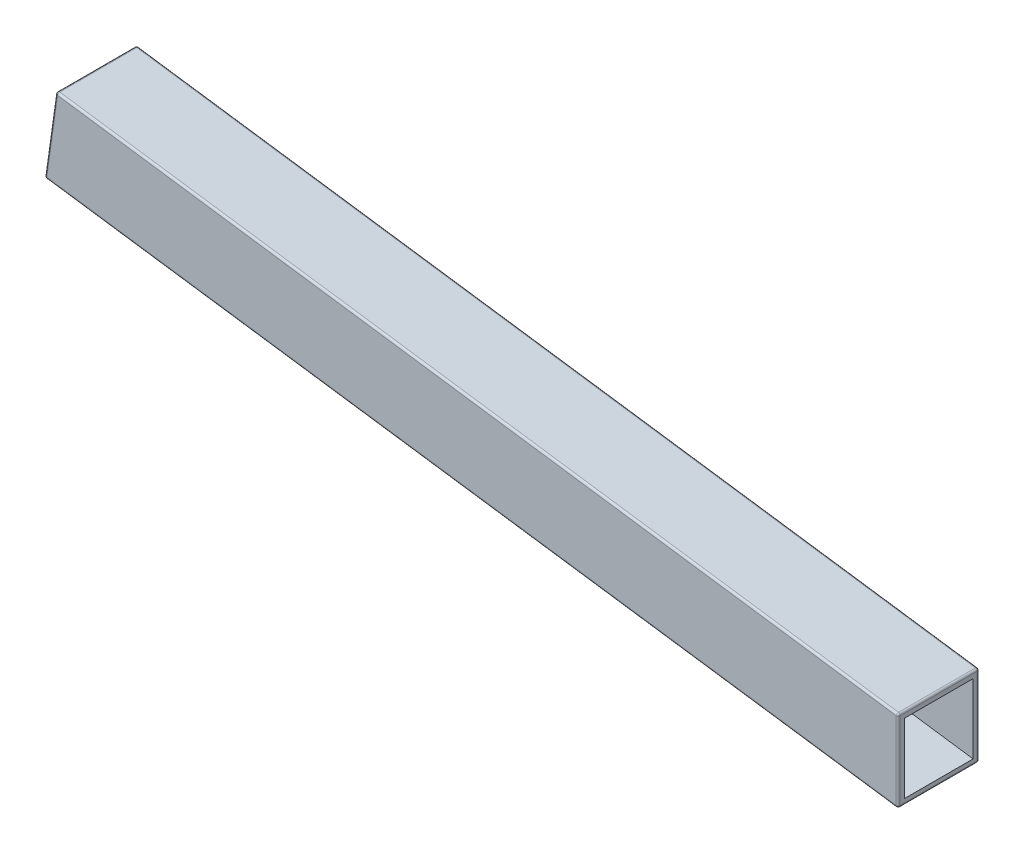
ISO-10303-21;
HEADER;
FILE_DESCRIPTION(('STEP AP214'),'2;1');
FILE_NAME('part.step','',(''),(''),'','','');
FILE_SCHEMA(('AUTOMOTIVE_DESIGN { 1 0 10303 214 1 1 1 1 }'));
ENDSEC;
DATA;
#1=APPLICATION_CONTEXT('core data for automotive mechanical design processes');
#2=APPLICATION_PROTOCOL_DEFINITION('international standard','automotive_design',2000,#1);
#3=PRODUCT_CONTEXT('',#1,'mechanical');
#4=PRODUCT('Part','Part','',(#3));
#5=PRODUCT_RELATED_PRODUCT_CATEGORY('part','',(#4));
#6=PRODUCT_DEFINITION_FORMATION('','',#4);
#7=PRODUCT_DEFINITION_CONTEXT('part definition',#1,'design');
#8=PRODUCT_DEFINITION('design','',#6,#7);
#9=PRODUCT_DEFINITION_SHAPE('','',#8);
#10=(LENGTH_UNIT() NAMED_UNIT(*) SI_UNIT(.MILLI.,.METRE.));
#11=(NAMED_UNIT(*) PLANE_ANGLE_UNIT() SI_UNIT($,.RADIAN.));
#12=(NAMED_UNIT(*) SI_UNIT($,.STERADIAN.) SOLID_ANGLE_UNIT());
#13=UNCERTAINTY_MEASURE_WITH_UNIT(LENGTH_MEASURE(1.E-05),#10,'distance_accuracy_value','');
#14=(GEOMETRIC_REPRESENTATION_CONTEXT(3) GLOBAL_UNCERTAINTY_ASSIGNED_CONTEXT((#13)) GLOBAL_UNIT_ASSIGNED_CONTEXT((#10,
#11,#12)) REPRESENTATION_CONTEXT('',''));
#15=CARTESIAN_POINT('',(0.,0.,0.));
#16=DIRECTION('',(0.,0.,1.));
#17=DIRECTION('',(1.,0.,0.));
#18=AXIS2_PLACEMENT_3D('',#15,#16,#17);
#19=CARTESIAN_POINT('',(0.,40.3931029007447,40.));
#20=DIRECTION('',(-1.,0.,0.));
#21=DIRECTION('',(0.,-1.,0.));
#22=AXIS2_PLACEMENT_3D('',#19,#20,#21);
#23=PLANE('',#22);
#24=DIRECTION('',(0.,1.,0.));
#25=VECTOR('',#24,1.);
#26=CARTESIAN_POINT('',(0.,40.3931029007447,39.));
#27=LINE('',#26,#25);
#28=CARTESIAN_POINT('',(0.,39.5238161629285,39.));
#29=VERTEX_POINT('',#28);
#30=CARTESIAN_POINT('',(0.,1.15036840722101,39.));
#31=VERTEX_POINT('',#30);
#32=EDGE_CURVE('E215',#29,#31,#27,.F.);
#33=ORIENTED_EDGE('',*,*,#32,.T.);
#34=DIRECTION('',(0.,0.,-1.));
#35=VECTOR('',#34,1.);
#36=CARTESIAN_POINT('',(0.,1.15036840722101,40.));
#37=LINE('',#36,#35);
#38=CARTESIAN_POINT('',(0.,1.15036840722101,1.));
#39=VERTEX_POINT('',#38);
#40=EDGE_CURVE('E221',#31,#39,#37,.T.);
#41=ORIENTED_EDGE('',*,*,#40,.T.);
#42=DIRECTION('',(0.,1.,0.));
#43=VECTOR('',#42,1.);
#44=CARTESIAN_POINT('',(0.,40.3931029007447,1.));
#45=LINE('',#44,#43);
#46=CARTESIAN_POINT('',(0.,39.5238161629285,1.));
#47=VERTEX_POINT('',#46);
#48=EDGE_CURVE('E219',#39,#47,#45,.T.);
#49=ORIENTED_EDGE('',*,*,#48,.T.);
#50=DIRECTION('',(0.,0.,-1.));
#51=VECTOR('',#50,1.);
#52=CARTESIAN_POINT('',(0.,39.5238161629285,40.));
#53=LINE('',#52,#51);
#54=EDGE_CURVE('E217',#47,#29,#53,.F.);
#55=ORIENTED_EDGE('',*,*,#54,.T.);
#56=EDGE_LOOP('',(#33,#41,#49,#55));
#57=FACE_BOUND('',#56,.T.);
#58=DIRECTION('',(0.,0.,-1.));
#59=VECTOR('',#58,1.);
#60=CARTESIAN_POINT('',(0.,37.3636201831886,40.));
#61=LINE('',#60,#59);
#62=CARTESIAN_POINT('',(0.,37.3636201831886,37.));
#63=VERTEX_POINT('',#62);
#64=CARTESIAN_POINT('',(0.,37.3636201831886,3.));
#65=VERTEX_POINT('',#64);
#66=EDGE_CURVE('E191',#63,#65,#61,.T.);
#67=ORIENTED_EDGE('',*,*,#66,.T.);
#68=DIRECTION('',(0.,-1.,0.));
#69=VECTOR('',#68,1.);
#70=CARTESIAN_POINT('',(0.,40.3931029007447,3.));
#71=LINE('',#70,#69);
#72=CARTESIAN_POINT('',(0.,3.02948271755557,3.));
#73=VERTEX_POINT('',#72);
#74=EDGE_CURVE('E194',#65,#73,#71,.T.);
#75=ORIENTED_EDGE('',*,*,#74,.T.);
#76=DIRECTION('',(0.,0.,1.));
#77=VECTOR('',#76,1.);
#78=CARTESIAN_POINT('',(0.,3.02948271755558,40.));
#79=LINE('',#78,#77);
#80=CARTESIAN_POINT('',(0.,3.02948271755558,37.));
#81=VERTEX_POINT('',#80);
#82=EDGE_CURVE('E186',#73,#81,#79,.T.);
#83=ORIENTED_EDGE('',*,*,#82,.T.);
#84=DIRECTION('',(0.,1.,0.));
#85=VECTOR('',#84,1.);
#86=CARTESIAN_POINT('',(0.,40.3931029007447,37.));
#87=LINE('',#86,#85);
#88=EDGE_CURVE('E162',#81,#63,#87,.T.);
#89=ORIENTED_EDGE('',*,*,#88,.T.);
#90=EDGE_LOOP('',(#67,#75,#83,#89));
#91=FACE_BOUND('',#90,.T.);
#92=ADVANCED_FACE('F41',(#57,#91),#23,.F.);
#93=CARTESIAN_POINT('',(-415.91258887146,98.8458053039722,40.));
#94=DIRECTION('',(-0.139173100960065,-0.99026806874157,0.));
#95=DIRECTION('',(0.99026806874157,-0.139173100960065,0.));
#96=AXIS2_PLACEMENT_3D('',#93,#94,#95);
#97=PLANE('',#96);
#98=DIRECTION('',(0.,0.,-1.));
#99=VECTOR('',#98,1.);
#100=CARTESIAN_POINT('',(-0.860826899039935,40.5140842316701,40.));
#101=LINE('',#100,#99);
#102=CARTESIAN_POINT('',(-0.860826899039935,40.5140842316701,39.));
#103=VERTEX_POINT('',#102);
#104=CARTESIAN_POINT('',(-0.860826899039935,40.5140842316701,1.));
#105=VERTEX_POINT('',#104);
#106=EDGE_CURVE('E237',#103,#105,#101,.T.);
#107=ORIENTED_EDGE('',*,*,#106,.T.);
#108=DIRECTION('',(-0.99026806874157,0.139173100960065,0.));
#109=VECTOR('',#108,1.);
#110=CARTESIAN_POINT('',(-415.91258887146,98.8458053039722,1.));
#111=LINE('',#110,#109);
#112=CARTESIAN_POINT('',(-414.922320802718,98.7066322030121,1.));
#113=VERTEX_POINT('',#112);
#114=EDGE_CURVE('E240',#105,#113,#111,.T.);
#115=ORIENTED_EDGE('',*,*,#114,.T.);
#116=DIRECTION('',(0.,0.,-1.));
#117=VECTOR('',#116,1.);
#118=CARTESIAN_POINT('',(-414.922320802718,98.7066322030121,40.));
#119=LINE('',#118,#117);
#120=CARTESIAN_POINT('',(-414.922320802718,98.7066322030121,39.));
#121=VERTEX_POINT('',#120);
#122=EDGE_CURVE('E235',#113,#121,#119,.F.);
#123=ORIENTED_EDGE('',*,*,#122,.T.);
#124=DIRECTION('',(-0.99026806874157,0.139173100960065,0.));
#125=VECTOR('',#124,1.);
#126=CARTESIAN_POINT('',(-415.91258887146,98.8458053039722,39.));
#127=LINE('',#126,#125);
#128=EDGE_CURVE('E233',#121,#103,#127,.F.);
#129=ORIENTED_EDGE('',*,*,#128,.T.);
#130=EDGE_LOOP('',(#107,#115,#123,#129));
#131=FACE_BOUND('',#130,.T.);
#132=ADVANCED_FACE('F324',(#131),#97,.F.);
#133=CARTESIAN_POINT('',(-421.479512909862,59.2350825543094,40.));
#134=DIRECTION('',(0.99026806874157,-0.139173100960066,0.));
#135=DIRECTION('',(0.139173100960066,0.99026806874157,0.));
#136=AXIS2_PLACEMENT_3D('',#133,#134,#135);
#137=PLANE('',#136);
#138=DIRECTION('',(-0.139173100960066,-0.99026806874157,0.));
#139=VECTOR('',#138,1.);
#140=CARTESIAN_POINT('',(-421.479512909862,59.2350825543094,1.));
#141=LINE('',#140,#139);
#142=CARTESIAN_POINT('',(-416.05176197242,97.8555372352306,1.));
#143=VERTEX_POINT('',#142);
#144=CARTESIAN_POINT('',(-421.340339808902,60.225350623051,1.));
#145=VERTEX_POINT('',#144);
#146=EDGE_CURVE('E210',#143,#145,#141,.T.);
#147=ORIENTED_EDGE('',*,*,#146,.T.);
#148=DIRECTION('',(0.,0.,-1.));
#149=VECTOR('',#148,1.);
#150=CARTESIAN_POINT('',(-421.340339808902,60.225350623051,40.));
#151=LINE('',#150,#149);
#152=CARTESIAN_POINT('',(-421.340339808902,60.225350623051,39.));
#153=VERTEX_POINT('',#152);
#154=EDGE_CURVE('E212',#145,#153,#151,.F.);
#155=ORIENTED_EDGE('',*,*,#154,.T.);
#156=DIRECTION('',(-0.139173100960066,-0.99026806874157,0.));
#157=VECTOR('',#156,1.);
#158=CARTESIAN_POINT('',(-421.479512909862,59.2350825543094,39.));
#159=LINE('',#158,#157);
#160=CARTESIAN_POINT('',(-416.05176197242,97.8555372352306,39.));
#161=VERTEX_POINT('',#160);
#162=EDGE_CURVE('E206',#153,#161,#159,.F.);
#163=ORIENTED_EDGE('',*,*,#162,.T.);
#164=DIRECTION('',(0.,0.,-1.));
#165=VECTOR('',#164,1.);
#166=CARTESIAN_POINT('',(-416.05176197242,97.8555372352307,40.));
#167=LINE('',#166,#165);
#168=EDGE_CURVE('E208',#161,#143,#167,.T.);
#169=ORIENTED_EDGE('',*,*,#168,.T.);
#170=EDGE_LOOP('',(#147,#155,#163,#169));
#171=FACE_BOUND('',#170,.T.);
#172=DIRECTION('',(0.,0.,1.));
#173=VECTOR('',#172,1.);
#174=CARTESIAN_POINT('',(-421.061993606982,62.2058867605341,37.));
#175=LINE('',#174,#173);
#176=CARTESIAN_POINT('',(-421.061993606982,62.2058867605341,3.));
#177=VERTEX_POINT('',#176);
#178=CARTESIAN_POINT('',(-421.061993606982,62.2058867605341,37.));
#179=VERTEX_POINT('',#178);
#180=EDGE_CURVE('E170',#177,#179,#175,.T.);
#181=ORIENTED_EDGE('',*,*,#180,.F.);
#182=DIRECTION('',(-0.139173100960066,-0.99026806874157,0.));
#183=VECTOR('',#182,1.);
#184=CARTESIAN_POINT('',(-421.061993606982,62.2058867605341,3.));
#185=LINE('',#184,#183);
#186=CARTESIAN_POINT('',(-416.33010817434,95.8750010977475,3.));
#187=VERTEX_POINT('',#186);
#188=EDGE_CURVE('E175',#187,#177,#185,.T.);
#189=ORIENTED_EDGE('',*,*,#188,.F.);
#190=DIRECTION('',(0.,0.,-1.));
#191=VECTOR('',#190,1.);
#192=CARTESIAN_POINT('',(-416.33010817434,95.8750010977475,3.));
#193=LINE('',#192,#191);
#194=CARTESIAN_POINT('',(-416.33010817434,95.8750010977475,37.));
#195=VERTEX_POINT('',#194);
#196=EDGE_CURVE('E179',#195,#187,#193,.T.);
#197=ORIENTED_EDGE('',*,*,#196,.F.);
#198=DIRECTION('',(0.139173100960066,0.99026806874157,0.));
#199=VECTOR('',#198,1.);
#200=CARTESIAN_POINT('',(-416.33010817434,95.8750010977475,37.));
#201=LINE('',#200,#199);
#202=EDGE_CURVE('E159',#179,#195,#201,.T.);
#203=ORIENTED_EDGE('',*,*,#202,.F.);
#204=EDGE_LOOP('',(#181,#189,#197,#203));
#205=FACE_BOUND('',#204,.T.);
#206=ADVANCED_FACE('F177',(#171,#205),#137,.F.);
#207=CARTESIAN_POINT('',(0.,0.,40.));
#208=DIRECTION('',(0.139173100960065,0.99026806874157,0.));
#209=DIRECTION('',(-0.99026806874157,0.139173100960065,0.));
#210=AXIS2_PLACEMENT_3D('',#207,#208,#209);
#211=PLANE('',#210);
#212=DIRECTION('',(0.,0.,-1.));
#213=VECTOR('',#212,1.);
#214=CARTESIAN_POINT('',(-420.48924484112,59.0959094533493,40.));
#215=LINE('',#214,#213);
#216=CARTESIAN_POINT('',(-420.489244841121,59.0959094533493,39.));
#217=VERTEX_POINT('',#216);
#218=CARTESIAN_POINT('',(-420.489244841121,59.0959094533493,1.));
#219=VERTEX_POINT('',#218);
#220=EDGE_CURVE('E201',#217,#219,#215,.T.);
#221=ORIENTED_EDGE('',*,*,#220,.T.);
#222=DIRECTION('',(0.99026806874157,-0.139173100960065,0.));
#223=VECTOR('',#222,1.);
#224=CARTESIAN_POINT('',(0.,0.,1.));
#225=LINE('',#224,#223);
#226=CARTESIAN_POINT('',(-1.13917310096006,0.160100338479439,1.));
#227=VERTEX_POINT('',#226);
#228=EDGE_CURVE('E204',#219,#227,#225,.T.);
#229=ORIENTED_EDGE('',*,*,#228,.T.);
#230=DIRECTION('',(0.,0.,-1.));
#231=VECTOR('',#230,1.);
#232=CARTESIAN_POINT('',(-1.13917310096006,0.160100338479439,40.));
#233=LINE('',#232,#231);
#234=CARTESIAN_POINT('',(-1.13917310096006,0.160100338479439,39.));
#235=VERTEX_POINT('',#234);
#236=EDGE_CURVE('E199',#227,#235,#233,.F.);
#237=ORIENTED_EDGE('',*,*,#236,.T.);
#238=DIRECTION('',(0.99026806874157,-0.139173100960065,0.));
#239=VECTOR('',#238,1.);
#240=CARTESIAN_POINT('',(0.,0.,39.));
#241=LINE('',#240,#239);
#242=EDGE_CURVE('E197',#235,#217,#241,.F.);
#243=ORIENTED_EDGE('',*,*,#242,.T.);
#244=EDGE_LOOP('',(#221,#229,#237,#243));
#245=FACE_BOUND('',#244,.T.);
#246=ADVANCED_FACE('F440',(#245),#211,.F.);
#247=CARTESIAN_POINT('',(0.,0.,40.));
#248=DIRECTION('',(0.,0.,-1.));
#249=DIRECTION('',(-1.,0.,0.));
#250=AXIS2_PLACEMENT_3D('',#247,#248,#249);
#251=PLANE('',#250);
#252=DIRECTION('',(-0.139173100960066,-0.99026806874157,0.));
#253=VECTOR('',#252,1.);
#254=CARTESIAN_POINT('',(-420.489244841121,59.0959094533496,40.));
#255=LINE('',#254,#253);
#256=CARTESIAN_POINT('',(-415.061493903678,97.7163641342706,40.));
#257=VERTEX_POINT('',#256);
#258=CARTESIAN_POINT('',(-420.350071740161,60.0861775220909,40.));
#259=VERTEX_POINT('',#258);
#260=EDGE_CURVE('E50',#257,#259,#255,.T.);
#261=ORIENTED_EDGE('',*,*,#260,.T.);
#262=DIRECTION('',(0.99026806874157,-0.139173100960065,0.));
#263=VECTOR('',#262,1.);
#264=CARTESIAN_POINT('',(0.139173100960065,0.99026806874157,40.));
#265=LINE('',#264,#263);
#266=CARTESIAN_POINT('',(-1.,1.15036840722101,40.));
#267=VERTEX_POINT('',#266);
#268=EDGE_CURVE('E11',#259,#267,#265,.T.);
#269=ORIENTED_EDGE('',*,*,#268,.T.);
#270=DIRECTION('',(0.,1.,0.));
#271=VECTOR('',#270,1.);
#272=CARTESIAN_POINT('',(-1.,0.,40.));
#273=LINE('',#272,#271);
#274=CARTESIAN_POINT('',(-1.,39.5238161629285,40.));
#275=VERTEX_POINT('',#274);
#276=EDGE_CURVE('E242',#267,#275,#273,.T.);
#277=ORIENTED_EDGE('',*,*,#276,.T.);
#278=DIRECTION('',(-0.99026806874157,0.139173100960065,0.));
#279=VECTOR('',#278,1.);
#280=CARTESIAN_POINT('',(5.42775093744255,38.6204546809213,40.));
#281=LINE('',#280,#279);
#282=EDGE_CURVE('E61',#275,#257,#281,.T.);
#283=ORIENTED_EDGE('',*,*,#282,.T.);
#284=EDGE_LOOP('',(#261,#269,#277,#283));
#285=FACE_BOUND('',#284,.T.);
#286=ADVANCED_FACE('F437',(#285),#251,.F.);
#287=CARTESIAN_POINT('',(0.,0.,0.));
#288=DIRECTION('',(0.,0.,-1.));
#289=DIRECTION('',(-1.,0.,0.));
#290=AXIS2_PLACEMENT_3D('',#287,#288,#289);
#291=PLANE('',#290);
#292=DIRECTION('',(0.99026806874157,-0.139173100960065,0.));
#293=VECTOR('',#292,1.);
#294=CARTESIAN_POINT('',(-421.340339808902,60.225350623051,0.));
#295=LINE('',#294,#293);
#296=CARTESIAN_POINT('',(-1.,1.15036840722101,0.));
#297=VERTEX_POINT('',#296);
#298=CARTESIAN_POINT('',(-420.350071740161,60.0861775220909,0.));
#299=VERTEX_POINT('',#298);
#300=EDGE_CURVE('E228',#297,#299,#295,.F.);
#301=ORIENTED_EDGE('',*,*,#300,.T.);
#302=DIRECTION('',(-0.139173100960066,-0.99026806874157,0.));
#303=VECTOR('',#302,1.);
#304=CARTESIAN_POINT('',(-414.922320802718,98.7066322030121,0.));
#305=LINE('',#304,#303);
#306=CARTESIAN_POINT('',(-415.061493903678,97.7163641342706,0.));
#307=VERTEX_POINT('',#306);
#308=EDGE_CURVE('E230',#299,#307,#305,.F.);
#309=ORIENTED_EDGE('',*,*,#308,.T.);
#310=DIRECTION('',(-0.99026806874157,0.139173100960065,0.));
#311=VECTOR('',#310,1.);
#312=CARTESIAN_POINT('',(-0.139173100960011,39.4028348320032,0.));
#313=LINE('',#312,#311);
#314=CARTESIAN_POINT('',(-1.,39.5238161629285,0.));
#315=VERTEX_POINT('',#314);
#316=EDGE_CURVE('E224',#307,#315,#313,.F.);
#317=ORIENTED_EDGE('',*,*,#316,.T.);
#318=DIRECTION('',(0.,1.,0.));
#319=VECTOR('',#318,1.);
#320=CARTESIAN_POINT('',(-1.,0.,0.));
#321=LINE('',#320,#319);
#322=EDGE_CURVE('E226',#315,#297,#321,.F.);
#323=ORIENTED_EDGE('',*,*,#322,.T.);
#324=EDGE_LOOP('',(#301,#309,#317,#323));
#325=FACE_BOUND('',#324,.T.);
#326=ADVANCED_FACE('F439',(#325),#291,.T.);
#327=CARTESIAN_POINT('',(0.417519302880309,2.97080420622441,3.));
#328=DIRECTION('',(0.,0.,-1.));
#329=DIRECTION('',(0.,1.,0.));
#330=AXIS2_PLACEMENT_3D('',#327,#328,#329);
#331=PLANE('',#330);
#332=DIRECTION('',(-0.99026806874157,0.139173100960066,0.));
#333=VECTOR('',#332,1.);
#334=CARTESIAN_POINT('',(5.14940473552256,36.6399185434378,3.));
#335=LINE('',#334,#333);
#336=EDGE_CURVE('E184',#65,#187,#335,.T.);
#337=ORIENTED_EDGE('',*,*,#336,.T.);
#338=ORIENTED_EDGE('',*,*,#188,.T.);
#339=DIRECTION('',(-0.99026806874157,0.139173100960066,0.));
#340=VECTOR('',#339,1.);
#341=CARTESIAN_POINT('',(0.417519302880309,2.97080420622441,3.));
#342=LINE('',#341,#340);
#343=EDGE_CURVE('E166',#73,#177,#342,.T.);
#344=ORIENTED_EDGE('',*,*,#343,.F.);
#345=ORIENTED_EDGE('',*,*,#74,.F.);
#346=EDGE_LOOP('',(#337,#338,#344,#345));
#347=FACE_BOUND('',#346,.T.);
#348=ADVANCED_FACE('F318',(#347),#331,.F.);
#349=CARTESIAN_POINT('',(5.14940473552256,36.6399185434378,3.));
#350=DIRECTION('',(0.139173100960066,0.99026806874157,0.));
#351=DIRECTION('',(-0.99026806874157,0.139173100960066,0.));
#352=AXIS2_PLACEMENT_3D('',#349,#350,#351);
#353=PLANE('',#352);
#354=DIRECTION('',(-0.99026806874157,0.139173100960066,0.));
#355=VECTOR('',#354,1.);
#356=CARTESIAN_POINT('',(5.14940473552256,36.6399185434378,37.));
#357=LINE('',#356,#355);
#358=EDGE_CURVE('E165',#63,#195,#357,.T.);
#359=ORIENTED_EDGE('',*,*,#358,.T.);
#360=ORIENTED_EDGE('',*,*,#196,.T.);
#361=ORIENTED_EDGE('',*,*,#336,.F.);
#362=ORIENTED_EDGE('',*,*,#66,.F.);
#363=EDGE_LOOP('',(#359,#360,#361,#362));
#364=FACE_BOUND('',#363,.T.);
#365=ADVANCED_FACE('F321',(#364),#353,.F.);
#366=CARTESIAN_POINT('',(5.14940473552256,36.6399185434378,37.));
#367=DIRECTION('',(0.,0.,1.));
#368=DIRECTION('',(0.,-1.,0.));
#369=AXIS2_PLACEMENT_3D('',#366,#367,#368);
#370=PLANE('',#369);
#371=DIRECTION('',(-0.99026806874157,0.139173100960066,0.));
#372=VECTOR('',#371,1.);
#373=CARTESIAN_POINT('',(0.417519302880309,2.97080420622441,37.));
#374=LINE('',#373,#372);
#375=EDGE_CURVE('E154',#81,#179,#374,.T.);
#376=ORIENTED_EDGE('',*,*,#375,.T.);
#377=ORIENTED_EDGE('',*,*,#202,.T.);
#378=ORIENTED_EDGE('',*,*,#358,.F.);
#379=ORIENTED_EDGE('',*,*,#88,.F.);
#380=EDGE_LOOP('',(#376,#377,#378,#379));
#381=FACE_BOUND('',#380,.T.);
#382=ADVANCED_FACE('F156',(#381),#370,.F.);
#383=CARTESIAN_POINT('',(0.417519302880309,2.97080420622441,37.));
#384=DIRECTION('',(-0.139173100960066,-0.99026806874157,0.));
#385=DIRECTION('',(0.99026806874157,-0.139173100960066,0.));
#386=AXIS2_PLACEMENT_3D('',#383,#384,#385);
#387=PLANE('',#386);
#388=ORIENTED_EDGE('',*,*,#343,.T.);
#389=ORIENTED_EDGE('',*,*,#180,.T.);
#390=ORIENTED_EDGE('',*,*,#375,.F.);
#391=ORIENTED_EDGE('',*,*,#82,.F.);
#392=EDGE_LOOP('',(#388,#389,#390,#391));
#393=FACE_BOUND('',#392,.T.);
#394=ADVANCED_FACE('F171',(#393),#387,.F.);
#395=CARTESIAN_POINT('',(-1.,39.5238161629285,40.));
#396=DIRECTION('',(0.,0.,-1.));
#397=DIRECTION('',(-1.,0.,0.));
#398=AXIS2_PLACEMENT_3D('',#395,#396,#397);
#399=CYLINDRICAL_SURFACE('',#398,1.);
#400=CARTESIAN_POINT('',(-1.,39.5238161629285,39.));
#401=DIRECTION('',(0.,0.,1.));
#402=DIRECTION('',(1.,0.,0.));
#403=AXIS2_PLACEMENT_3D('',#400,#401,#402);
#404=CIRCLE('',#403,1.);
#405=EDGE_CURVE('E45',#29,#103,#404,.T.);
#406=ORIENTED_EDGE('',*,*,#405,.F.);
#407=ORIENTED_EDGE('',*,*,#54,.F.);
#408=CARTESIAN_POINT('',(-1.,39.5238161629285,1.));
#409=DIRECTION('',(0.,0.,-1.));
#410=DIRECTION('',(-1.,0.,0.));
#411=AXIS2_PLACEMENT_3D('',#408,#409,#410);
#412=CIRCLE('',#411,1.);
#413=EDGE_CURVE('E306',#105,#47,#412,.T.);
#414=ORIENTED_EDGE('',*,*,#413,.F.);
#415=ORIENTED_EDGE('',*,*,#106,.F.);
#416=EDGE_LOOP('',(#406,#407,#414,#415));
#417=FACE_BOUND('',#416,.T.);
#418=ADVANCED_FACE('F43',(#417),#399,.T.);
#419=CARTESIAN_POINT('',(-1.,39.5238161629285,39.));
#420=DIRECTION('',(0.,0.,1.));
#421=DIRECTION('',(1.,0.,0.));
#422=AXIS2_PLACEMENT_3D('',#419,#420,#421);
#423=SPHERICAL_SURFACE('',#422,1.);
#424=CARTESIAN_POINT('',(-1.,39.5238161629285,39.));
#425=DIRECTION('',(0.,1.,0.));
#426=DIRECTION('',(0.,0.,1.));
#427=AXIS2_PLACEMENT_3D('',#424,#425,#426);
#428=CIRCLE('',#427,1.);
#429=EDGE_CURVE('E301',#29,#275,#428,.F.);
#430=ORIENTED_EDGE('',*,*,#429,.F.);
#431=ORIENTED_EDGE('',*,*,#405,.T.);
#432=CARTESIAN_POINT('',(-1.,39.5238161629285,39.));
#433=DIRECTION('',(0.99026806874157,-0.139173100960066,0.));
#434=DIRECTION('',(0.139173100960065,0.99026806874157,0.));
#435=AXIS2_PLACEMENT_3D('',#432,#433,#434);
#436=CIRCLE('',#435,1.);
#437=EDGE_CURVE('E304',#275,#103,#436,.F.);
#438=ORIENTED_EDGE('',*,*,#437,.F.);
#439=EDGE_LOOP('',(#430,#431,#438));
#440=FACE_BOUND('',#439,.T.);
#441=ADVANCED_FACE('F404',(#440),#423,.T.);
#442=CARTESIAN_POINT('',(-1.,39.5238161629285,1.));
#443=DIRECTION('',(0.,0.,1.));
#444=DIRECTION('',(1.,0.,0.));
#445=AXIS2_PLACEMENT_3D('',#442,#443,#444);
#446=SPHERICAL_SURFACE('',#445,1.);
#447=CARTESIAN_POINT('',(-1.,39.5238161629285,1.));
#448=DIRECTION('',(0.99026806874157,-0.139173100960065,0.));
#449=DIRECTION('',(0.139173100960065,0.99026806874157,0.));
#450=AXIS2_PLACEMENT_3D('',#447,#448,#449);
#451=CIRCLE('',#450,1.);
#452=EDGE_CURVE('E295',#105,#315,#451,.F.);
#453=ORIENTED_EDGE('',*,*,#452,.F.);
#454=ORIENTED_EDGE('',*,*,#413,.T.);
#455=CARTESIAN_POINT('',(-1.,39.5238161629285,1.));
#456=DIRECTION('',(0.,1.,0.));
#457=DIRECTION('',(0.,0.,1.));
#458=AXIS2_PLACEMENT_3D('',#455,#456,#457);
#459=CIRCLE('',#458,1.);
#460=EDGE_CURVE('E298',#315,#47,#459,.F.);
#461=ORIENTED_EDGE('',*,*,#460,.F.);
#462=EDGE_LOOP('',(#453,#454,#461));
#463=FACE_BOUND('',#462,.T.);
#464=ADVANCED_FACE('F401',(#463),#446,.T.);
#465=CARTESIAN_POINT('',(5.42775093744255,38.6204546809213,39.));
#466=DIRECTION('',(-0.99026806874157,0.139173100960065,0.));
#467=DIRECTION('',(-0.139173100960065,-0.99026806874157,0.));
#468=AXIS2_PLACEMENT_3D('',#465,#466,#467);
#469=CYLINDRICAL_SURFACE('',#468,1.);
#470=ORIENTED_EDGE('',*,*,#437,.T.);
#471=ORIENTED_EDGE('',*,*,#128,.F.);
#472=CARTESIAN_POINT('',(-415.061493903678,97.7163641342706,39.));
#473=DIRECTION('',(-0.990268068741562,0.13917310096012,0.));
#474=DIRECTION('',(-0.139173100960121,-0.990268068741563,0.));
#475=AXIS2_PLACEMENT_3D('',#472,#473,#474);
#476=CIRCLE('',#475,1.);
#477=EDGE_CURVE('E289',#257,#121,#476,.T.);
#478=ORIENTED_EDGE('',*,*,#477,.F.);
#479=ORIENTED_EDGE('',*,*,#282,.F.);
#480=EDGE_LOOP('',(#470,#471,#478,#479));
#481=FACE_BOUND('',#480,.T.);
#482=ADVANCED_FACE('F397',(#481),#469,.T.);
#483=CARTESIAN_POINT('',(-1.,0.,39.));
#484=DIRECTION('',(0.,1.,0.));
#485=DIRECTION('',(-1.,0.,0.));
#486=AXIS2_PLACEMENT_3D('',#483,#484,#485);
#487=CYLINDRICAL_SURFACE('',#486,1.);
#488=ORIENTED_EDGE('',*,*,#429,.T.);
#489=ORIENTED_EDGE('',*,*,#276,.F.);
#490=CARTESIAN_POINT('',(-1.,1.15036840722101,39.));
#491=DIRECTION('',(0.,-1.,0.));
#492=DIRECTION('',(0.,0.,-1.));
#493=AXIS2_PLACEMENT_3D('',#490,#491,#492);
#494=CIRCLE('',#493,1.);
#495=EDGE_CURVE('E286',#31,#267,#494,.T.);
#496=ORIENTED_EDGE('',*,*,#495,.F.);
#497=ORIENTED_EDGE('',*,*,#32,.F.);
#498=EDGE_LOOP('',(#488,#489,#496,#497));
#499=FACE_BOUND('',#498,.T.);
#500=ADVANCED_FACE('F393',(#499),#487,.T.);
#501=CARTESIAN_POINT('',(-1.,1.15036840722101,40.));
#502=DIRECTION('',(0.,0.,-1.));
#503=DIRECTION('',(-1.,0.,0.));
#504=AXIS2_PLACEMENT_3D('',#501,#502,#503);
#505=CYLINDRICAL_SURFACE('',#504,1.);
#506=CARTESIAN_POINT('',(-1.,1.15036840722101,1.));
#507=DIRECTION('',(0.,0.,-1.));
#508=DIRECTION('',(-1.,0.,0.));
#509=AXIS2_PLACEMENT_3D('',#506,#507,#508);
#510=CIRCLE('',#509,1.);
#511=EDGE_CURVE('E280',#39,#227,#510,.T.);
#512=ORIENTED_EDGE('',*,*,#511,.F.);
#513=ORIENTED_EDGE('',*,*,#40,.F.);
#514=CARTESIAN_POINT('',(-1.,1.15036840722101,39.));
#515=DIRECTION('',(0.,0.,1.));
#516=DIRECTION('',(1.,0.,0.));
#517=AXIS2_PLACEMENT_3D('',#514,#515,#516);
#518=CIRCLE('',#517,1.);
#519=EDGE_CURVE('E283',#235,#31,#518,.T.);
#520=ORIENTED_EDGE('',*,*,#519,.F.);
#521=ORIENTED_EDGE('',*,*,#236,.F.);
#522=EDGE_LOOP('',(#512,#513,#520,#521));
#523=FACE_BOUND('',#522,.T.);
#524=ADVANCED_FACE('F389',(#523),#505,.T.);
#525=CARTESIAN_POINT('',(-1.,40.3931029007447,1.));
#526=DIRECTION('',(0.,-1.,0.));
#527=DIRECTION('',(1.,0.,0.));
#528=AXIS2_PLACEMENT_3D('',#525,#526,#527);
#529=CYLINDRICAL_SURFACE('',#528,1.);
#530=ORIENTED_EDGE('',*,*,#460,.T.);
#531=ORIENTED_EDGE('',*,*,#48,.F.);
#532=CARTESIAN_POINT('',(-1.,1.15036840722101,1.));
#533=DIRECTION('',(0.,-1.,0.));
#534=DIRECTION('',(1.,0.,0.));
#535=AXIS2_PLACEMENT_3D('',#532,#533,#534);
#536=CIRCLE('',#535,1.);
#537=EDGE_CURVE('E278',#297,#39,#536,.T.);
#538=ORIENTED_EDGE('',*,*,#537,.F.);
#539=ORIENTED_EDGE('',*,*,#322,.F.);
#540=EDGE_LOOP('',(#530,#531,#538,#539));
#541=FACE_BOUND('',#540,.T.);
#542=ADVANCED_FACE('F385',(#541),#529,.T.);
#543=CARTESIAN_POINT('',(-416.05176197242,97.8555372352306,1.));
#544=DIRECTION('',(0.99026806874157,-0.139173100960065,0.));
#545=DIRECTION('',(0.139173100960065,0.99026806874157,0.));
#546=AXIS2_PLACEMENT_3D('',#543,#544,#545);
#547=CYLINDRICAL_SURFACE('',#546,1.);
#548=ORIENTED_EDGE('',*,*,#452,.T.);
#549=ORIENTED_EDGE('',*,*,#316,.F.);
#550=CARTESIAN_POINT('',(-415.061493903678,97.7163641342706,1.));
#551=DIRECTION('',(-0.99026806874157,0.139173100960066,0.));
#552=DIRECTION('',(-0.139173100960066,-0.99026806874157,0.));
#553=AXIS2_PLACEMENT_3D('',#550,#551,#552);
#554=CIRCLE('',#553,1.);
#555=EDGE_CURVE('E275',#113,#307,#554,.T.);
#556=ORIENTED_EDGE('',*,*,#555,.F.);
#557=ORIENTED_EDGE('',*,*,#114,.F.);
#558=EDGE_LOOP('',(#548,#549,#556,#557));
#559=FACE_BOUND('',#558,.T.);
#560=ADVANCED_FACE('F381',(#559),#547,.T.);
#561=CARTESIAN_POINT('',(-415.061493903678,97.7163641342706,40.));
#562=DIRECTION('',(0.,0.,-1.));
#563=DIRECTION('',(-1.,0.,0.));
#564=AXIS2_PLACEMENT_3D('',#561,#562,#563);
#565=CYLINDRICAL_SURFACE('',#564,1.);
#566=CARTESIAN_POINT('',(-415.061493903678,97.7163641342706,39.));
#567=DIRECTION('',(0.,0.,1.));
#568=DIRECTION('',(1.,0.,0.));
#569=AXIS2_PLACEMENT_3D('',#566,#567,#568);
#570=CIRCLE('',#569,1.);
#571=EDGE_CURVE('E292',#121,#161,#570,.T.);
#572=ORIENTED_EDGE('',*,*,#571,.F.);
#573=ORIENTED_EDGE('',*,*,#122,.F.);
#574=CARTESIAN_POINT('',(-415.061493903678,97.7163641342706,1.));
#575=DIRECTION('',(0.,0.,-1.));
#576=DIRECTION('',(-1.,0.,0.));
#577=AXIS2_PLACEMENT_3D('',#574,#575,#576);
#578=CIRCLE('',#577,1.);
#579=EDGE_CURVE('E272',#143,#113,#578,.T.);
#580=ORIENTED_EDGE('',*,*,#579,.F.);
#581=ORIENTED_EDGE('',*,*,#168,.F.);
#582=EDGE_LOOP('',(#572,#573,#580,#581));
#583=FACE_BOUND('',#582,.T.);
#584=ADVANCED_FACE('F377',(#583),#565,.T.);
#585=CARTESIAN_POINT('',(-415.061493903678,97.7163641342706,39.));
#586=DIRECTION('',(0.,0.,1.));
#587=DIRECTION('',(1.,0.,0.));
#588=AXIS2_PLACEMENT_3D('',#585,#586,#587);
#589=SPHERICAL_SURFACE('',#588,1.);
#590=ORIENTED_EDGE('',*,*,#477,.T.);
#591=ORIENTED_EDGE('',*,*,#571,.T.);
#592=CARTESIAN_POINT('',(-415.061493903678,97.7163641342706,39.));
#593=DIRECTION('',(0.139173100960064,0.990268068741571,0.));
#594=DIRECTION('',(-0.990268068741571,0.139173100960064,0.));
#595=AXIS2_PLACEMENT_3D('',#592,#593,#594);
#596=CIRCLE('',#595,1.);
#597=EDGE_CURVE('E269',#257,#161,#596,.F.);
#598=ORIENTED_EDGE('',*,*,#597,.F.);
#599=EDGE_LOOP('',(#590,#591,#598));
#600=FACE_BOUND('',#599,.T.);
#601=ADVANCED_FACE('F373',(#600),#589,.T.);
#602=CARTESIAN_POINT('',(-1.,1.15036840722101,39.));
#603=DIRECTION('',(0.,0.,1.));
#604=DIRECTION('',(1.,0.,0.));
#605=AXIS2_PLACEMENT_3D('',#602,#603,#604);
#606=SPHERICAL_SURFACE('',#605,1.);
#607=ORIENTED_EDGE('',*,*,#519,.T.);
#608=ORIENTED_EDGE('',*,*,#495,.T.);
#609=CARTESIAN_POINT('',(-1.,1.15036840722101,39.));
#610=DIRECTION('',(0.99026806874157,-0.139173100960065,0.));
#611=DIRECTION('',(0.139173100960065,0.99026806874157,0.));
#612=AXIS2_PLACEMENT_3D('',#609,#610,#611);
#613=CIRCLE('',#612,1.);
#614=EDGE_CURVE('E267',#235,#267,#613,.F.);
#615=ORIENTED_EDGE('',*,*,#614,.F.);
#616=EDGE_LOOP('',(#607,#608,#615));
#617=FACE_BOUND('',#616,.T.);
#618=ADVANCED_FACE('F369',(#617),#606,.T.);
#619=CARTESIAN_POINT('',(-1.,1.15036840722101,1.));
#620=DIRECTION('',(0.,0.,1.));
#621=DIRECTION('',(1.,0.,0.));
#622=AXIS2_PLACEMENT_3D('',#619,#620,#621);
#623=SPHERICAL_SURFACE('',#622,1.);
#624=ORIENTED_EDGE('',*,*,#537,.T.);
#625=ORIENTED_EDGE('',*,*,#511,.T.);
#626=CARTESIAN_POINT('',(-1.,1.15036840722101,1.));
#627=DIRECTION('',(0.99026806874157,-0.139173100960065,0.));
#628=DIRECTION('',(0.139173100960065,0.99026806874157,0.));
#629=AXIS2_PLACEMENT_3D('',#626,#627,#628);
#630=CIRCLE('',#629,1.);
#631=EDGE_CURVE('E264',#297,#227,#630,.F.);
#632=ORIENTED_EDGE('',*,*,#631,.F.);
#633=EDGE_LOOP('',(#624,#625,#632));
#634=FACE_BOUND('',#633,.T.);
#635=ADVANCED_FACE('F365',(#634),#623,.T.);
#636=CARTESIAN_POINT('',(-415.061493903678,97.7163641342706,1.));
#637=DIRECTION('',(0.,0.,1.));
#638=DIRECTION('',(1.,0.,0.));
#639=AXIS2_PLACEMENT_3D('',#636,#637,#638);
#640=SPHERICAL_SURFACE('',#639,1.);
#641=ORIENTED_EDGE('',*,*,#579,.T.);
#642=ORIENTED_EDGE('',*,*,#555,.T.);
#643=CARTESIAN_POINT('',(-415.061493903678,97.7163641342706,1.));
#644=DIRECTION('',(0.139173100960064,0.990268068741571,0.));
#645=DIRECTION('',(-0.990268068741571,0.139173100960064,0.));
#646=AXIS2_PLACEMENT_3D('',#643,#644,#645);
#647=CIRCLE('',#646,1.);
#648=EDGE_CURVE('E262',#143,#307,#647,.F.);
#649=ORIENTED_EDGE('',*,*,#648,.F.);
#650=EDGE_LOOP('',(#641,#642,#649));
#651=FACE_BOUND('',#650,.T.);
#652=ADVANCED_FACE('F361',(#651),#640,.T.);
#653=CARTESIAN_POINT('',(-420.489244841121,59.0959094533496,39.));
#654=DIRECTION('',(-0.139173100960066,-0.99026806874157,0.));
#655=DIRECTION('',(0.99026806874157,-0.139173100960066,0.));
#656=AXIS2_PLACEMENT_3D('',#653,#654,#655);
#657=CYLINDRICAL_SURFACE('',#656,1.);
#658=ORIENTED_EDGE('',*,*,#597,.T.);
#659=ORIENTED_EDGE('',*,*,#162,.F.);
#660=CARTESIAN_POINT('',(-420.350071740161,60.0861775220909,39.));
#661=DIRECTION('',(-0.139173100960079,-0.990268068741568,0.));
#662=DIRECTION('',(0.990268068741569,-0.139173100960079,0.));
#663=AXIS2_PLACEMENT_3D('',#660,#661,#662);
#664=CIRCLE('',#663,1.);
#665=EDGE_CURVE('E259',#259,#153,#664,.T.);
#666=ORIENTED_EDGE('',*,*,#665,.F.);
#667=ORIENTED_EDGE('',*,*,#260,.F.);
#668=EDGE_LOOP('',(#658,#659,#666,#667));
#669=FACE_BOUND('',#668,.T.);
#670=ADVANCED_FACE('F357',(#669),#657,.T.);
#671=CARTESIAN_POINT('',(0.139173100960065,0.99026806874157,39.));
#672=DIRECTION('',(0.99026806874157,-0.139173100960065,0.));
#673=DIRECTION('',(0.139173100960065,0.99026806874157,0.));
#674=AXIS2_PLACEMENT_3D('',#671,#672,#673);
#675=CYLINDRICAL_SURFACE('',#674,1.);
#676=ORIENTED_EDGE('',*,*,#614,.T.);
#677=ORIENTED_EDGE('',*,*,#268,.F.);
#678=CARTESIAN_POINT('',(-420.350071740161,60.0861775220909,39.));
#679=DIRECTION('',(-0.99026806874157,0.139173100960066,-1.10907548428637E-13));
#680=DIRECTION('',(-0.139173100960066,-0.99026806874157,0.));
#681=AXIS2_PLACEMENT_3D('',#678,#679,#680);
#682=CIRCLE('',#681,1.);
#683=EDGE_CURVE('E256',#217,#259,#682,.T.);
#684=ORIENTED_EDGE('',*,*,#683,.F.);
#685=ORIENTED_EDGE('',*,*,#242,.F.);
#686=EDGE_LOOP('',(#676,#677,#684,#685));
#687=FACE_BOUND('',#686,.T.);
#688=ADVANCED_FACE('F353',(#687),#675,.T.);
#689=CARTESIAN_POINT('',(0.139173100960065,0.99026806874157,1.));
#690=DIRECTION('',(-0.99026806874157,0.139173100960065,0.));
#691=DIRECTION('',(-0.139173100960065,-0.99026806874157,0.));
#692=AXIS2_PLACEMENT_3D('',#689,#690,#691);
#693=CYLINDRICAL_SURFACE('',#692,1.);
#694=ORIENTED_EDGE('',*,*,#631,.T.);
#695=ORIENTED_EDGE('',*,*,#228,.F.);
#696=CARTESIAN_POINT('',(-420.350071740161,60.0861775220909,1.));
#697=DIRECTION('',(-0.990268068741578,0.139173100960011,0.));
#698=DIRECTION('',(-0.139173100960011,-0.990268068741578,0.));
#699=AXIS2_PLACEMENT_3D('',#696,#697,#698);
#700=CIRCLE('',#699,1.);
#701=EDGE_CURVE('E253',#299,#219,#700,.T.);
#702=ORIENTED_EDGE('',*,*,#701,.F.);
#703=ORIENTED_EDGE('',*,*,#300,.F.);
#704=EDGE_LOOP('',(#694,#695,#702,#703));
#705=FACE_BOUND('',#704,.T.);
#706=ADVANCED_FACE('F349',(#705),#693,.T.);
#707=CARTESIAN_POINT('',(-420.489244841121,59.0959094533493,1.));
#708=DIRECTION('',(0.139173100960066,0.99026806874157,0.));
#709=DIRECTION('',(-0.99026806874157,0.139173100960066,0.));
#710=AXIS2_PLACEMENT_3D('',#707,#708,#709);
#711=CYLINDRICAL_SURFACE('',#710,1.);
#712=ORIENTED_EDGE('',*,*,#648,.T.);
#713=ORIENTED_EDGE('',*,*,#308,.F.);
#714=CARTESIAN_POINT('',(-420.350071740161,60.0861775220909,1.));
#715=DIRECTION('',(-0.139173100960064,-0.990268068741571,0.));
#716=DIRECTION('',(0.990268068741571,-0.139173100960064,0.));
#717=AXIS2_PLACEMENT_3D('',#714,#715,#716);
#718=CIRCLE('',#717,1.);
#719=EDGE_CURVE('E250',#145,#299,#718,.T.);
#720=ORIENTED_EDGE('',*,*,#719,.F.);
#721=ORIENTED_EDGE('',*,*,#146,.F.);
#722=EDGE_LOOP('',(#712,#713,#720,#721));
#723=FACE_BOUND('',#722,.T.);
#724=ADVANCED_FACE('F345',(#723),#711,.T.);
#725=CARTESIAN_POINT('',(-420.350071740161,60.0861775220909,39.));
#726=DIRECTION('',(0.,0.,1.));
#727=DIRECTION('',(1.,0.,0.));
#728=AXIS2_PLACEMENT_3D('',#725,#726,#727);
#729=SPHERICAL_SURFACE('',#728,1.);
#730=ORIENTED_EDGE('',*,*,#683,.T.);
#731=ORIENTED_EDGE('',*,*,#665,.T.);
#732=CARTESIAN_POINT('',(-420.350071740161,60.0861775220909,39.));
#733=DIRECTION('',(0.,0.,1.));
#734=DIRECTION('',(1.,0.,0.));
#735=AXIS2_PLACEMENT_3D('',#732,#733,#734);
#736=CIRCLE('',#735,1.);
#737=EDGE_CURVE('E248',#217,#153,#736,.F.);
#738=ORIENTED_EDGE('',*,*,#737,.F.);
#739=EDGE_LOOP('',(#730,#731,#738));
#740=FACE_BOUND('',#739,.T.);
#741=ADVANCED_FACE('F341',(#740),#729,.T.);
#742=CARTESIAN_POINT('',(-420.350071740161,60.0861775220909,1.));
#743=DIRECTION('',(0.,0.,1.));
#744=DIRECTION('',(1.,0.,0.));
#745=AXIS2_PLACEMENT_3D('',#742,#743,#744);
#746=SPHERICAL_SURFACE('',#745,1.);
#747=ORIENTED_EDGE('',*,*,#719,.T.);
#748=ORIENTED_EDGE('',*,*,#701,.T.);
#749=CARTESIAN_POINT('',(-420.350071740161,60.0861775220909,1.));
#750=DIRECTION('',(0.,0.,-1.));
#751=DIRECTION('',(-1.,0.,0.));
#752=AXIS2_PLACEMENT_3D('',#749,#750,#751);
#753=CIRCLE('',#752,1.);
#754=EDGE_CURVE('E246',#145,#219,#753,.F.);
#755=ORIENTED_EDGE('',*,*,#754,.F.);
#756=EDGE_LOOP('',(#747,#748,#755));
#757=FACE_BOUND('',#756,.T.);
#758=ADVANCED_FACE('F337',(#757),#746,.T.);
#759=CARTESIAN_POINT('',(-420.350071740161,60.0861775220909,40.));
#760=DIRECTION('',(0.,0.,-1.));
#761=DIRECTION('',(-1.,0.,0.));
#762=AXIS2_PLACEMENT_3D('',#759,#760,#761);
#763=CYLINDRICAL_SURFACE('',#762,1.);
#764=ORIENTED_EDGE('',*,*,#737,.T.);
#765=ORIENTED_EDGE('',*,*,#154,.F.);
#766=ORIENTED_EDGE('',*,*,#754,.T.);
#767=ORIENTED_EDGE('',*,*,#220,.F.);
#768=EDGE_LOOP('',(#764,#765,#766,#767));
#769=FACE_BOUND('',#768,.T.);
#770=ADVANCED_FACE('F334',(#769),#763,.T.);
#771=CLOSED_SHELL('',(#92,#132,#206,#246,#286,#326,#348,#365,#382,#394,#418,#441,#464,#482,#500,
#524,#542,#560,#584,#601,#618,#635,#652,#670,#688,#706,#724,#741,#758,#770));
#772=MANIFOLD_SOLID_BREP('B2',#771);
#773=ADVANCED_BREP_SHAPE_REPRESENTATION('',(#18,#772),#14);
#774=SHAPE_DEFINITION_REPRESENTATION(#9,#773);
ENDSEC;
END-ISO-10303-21;
